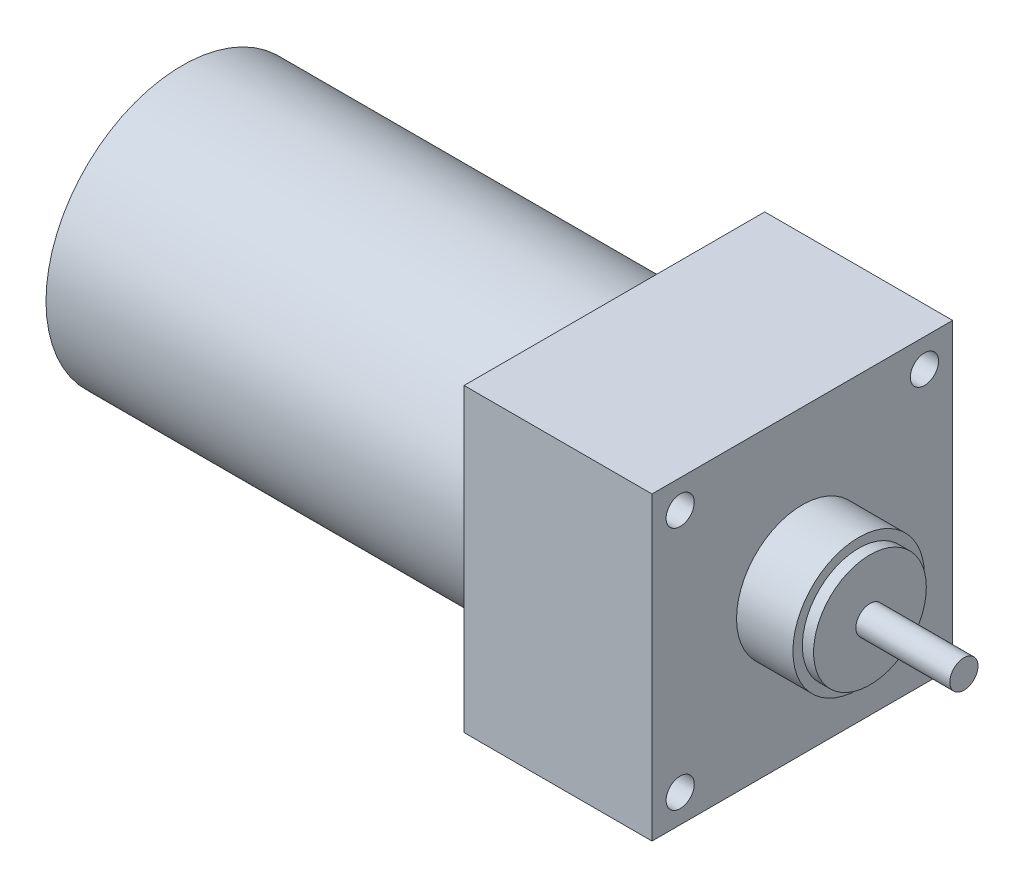
ISO-10303-21;
HEADER;
FILE_DESCRIPTION(('STEP AP214'),'2;1');
FILE_NAME('part.step','',(''),(''),'','','');
FILE_SCHEMA(('AUTOMOTIVE_DESIGN { 1 0 10303 214 1 1 1 1 }'));
ENDSEC;
DATA;
#1=APPLICATION_CONTEXT('core data for automotive mechanical design processes');
#2=APPLICATION_PROTOCOL_DEFINITION('international standard','automotive_design',2000,#1);
#3=PRODUCT_CONTEXT('',#1,'mechanical');
#4=PRODUCT('Part','Part','',(#3));
#5=PRODUCT_RELATED_PRODUCT_CATEGORY('part','',(#4));
#6=PRODUCT_DEFINITION_FORMATION('','',#4);
#7=PRODUCT_DEFINITION_CONTEXT('part definition',#1,'design');
#8=PRODUCT_DEFINITION('design','',#6,#7);
#9=PRODUCT_DEFINITION_SHAPE('','',#8);
#10=(LENGTH_UNIT() NAMED_UNIT(*) SI_UNIT(.MILLI.,.METRE.));
#11=(NAMED_UNIT(*) PLANE_ANGLE_UNIT() SI_UNIT($,.RADIAN.));
#12=(NAMED_UNIT(*) SI_UNIT($,.STERADIAN.) SOLID_ANGLE_UNIT());
#13=UNCERTAINTY_MEASURE_WITH_UNIT(LENGTH_MEASURE(1.E-05),#10,'distance_accuracy_value','');
#14=(GEOMETRIC_REPRESENTATION_CONTEXT(3) GLOBAL_UNCERTAINTY_ASSIGNED_CONTEXT((#13)) GLOBAL_UNIT_ASSIGNED_CONTEXT((#10,
#11,#12)) REPRESENTATION_CONTEXT('',''));
#15=CARTESIAN_POINT('',(0.,0.,0.));
#16=DIRECTION('',(0.,0.,1.));
#17=DIRECTION('',(1.,0.,0.));
#18=AXIS2_PLACEMENT_3D('',#15,#16,#17);
#19=CARTESIAN_POINT('',(27.2,0.,0.));
#20=DIRECTION('',(1.,0.,0.));
#21=DIRECTION('',(0.,0.,-1.));
#22=AXIS2_PLACEMENT_3D('',#19,#20,#21);
#23=PLANE('',#22);
#24=CARTESIAN_POINT('',(27.2,0.,0.));
#25=DIRECTION('',(1.,0.,0.));
#26=DIRECTION('',(0.,0.,-1.));
#27=AXIS2_PLACEMENT_3D('',#24,#25,#26);
#28=CIRCLE('',#27,6.);
#29=CARTESIAN_POINT('',(27.2,0.,-6.));
#30=VERTEX_POINT('',#29);
#31=EDGE_CURVE('E129',#30,#30,#28,.T.);
#32=ORIENTED_EDGE('',*,*,#31,.T.);
#33=EDGE_LOOP('',(#32));
#34=FACE_BOUND('',#33,.T.);
#35=CARTESIAN_POINT('',(27.2,0.,0.));
#36=DIRECTION('',(1.,0.,0.));
#37=DIRECTION('',(0.,0.,-1.));
#38=AXIS2_PLACEMENT_3D('',#35,#36,#37);
#39=CIRCLE('',#38,1.5);
#40=CARTESIAN_POINT('',(27.2,0.,-1.5));
#41=VERTEX_POINT('',#40);
#42=EDGE_CURVE('E138',#41,#41,#39,.T.);
#43=ORIENTED_EDGE('',*,*,#42,.F.);
#44=EDGE_LOOP('',(#43));
#45=FACE_BOUND('',#44,.T.);
#46=ADVANCED_FACE('F36',(#34,#45),#23,.T.);
#47=CARTESIAN_POINT('',(26.,0.,0.));
#48=DIRECTION('',(1.,0.,0.));
#49=DIRECTION('',(0.,0.,-1.));
#50=AXIS2_PLACEMENT_3D('',#47,#48,#49);
#51=PLANE('',#50);
#52=CARTESIAN_POINT('',(26.,0.,0.));
#53=DIRECTION('',(1.,0.,0.));
#54=DIRECTION('',(0.,0.,-1.));
#55=AXIS2_PLACEMENT_3D('',#52,#53,#54);
#56=CIRCLE('',#55,7.00000000000001);
#57=CARTESIAN_POINT('',(26.,0.,-7.00000000000001));
#58=VERTEX_POINT('',#57);
#59=EDGE_CURVE('E124',#58,#58,#56,.T.);
#60=ORIENTED_EDGE('',*,*,#59,.T.);
#61=EDGE_LOOP('',(#60));
#62=FACE_BOUND('',#61,.T.);
#63=CARTESIAN_POINT('',(26.,0.,0.));
#64=DIRECTION('',(1.,0.,0.));
#65=DIRECTION('',(0.,0.,-1.));
#66=AXIS2_PLACEMENT_3D('',#63,#64,#65);
#67=CIRCLE('',#66,6.);
#68=CARTESIAN_POINT('',(26.,0.,-6.));
#69=VERTEX_POINT('',#68);
#70=EDGE_CURVE('E132',#69,#69,#67,.T.);
#71=ORIENTED_EDGE('',*,*,#70,.F.);
#72=EDGE_LOOP('',(#71));
#73=FACE_BOUND('',#72,.T.);
#74=ADVANCED_FACE('F178',(#62,#73),#51,.T.);
#75=CARTESIAN_POINT('',(20.,0.,0.));
#76=DIRECTION('',(-1.,0.,0.));
#77=DIRECTION('',(0.,0.,1.));
#78=AXIS2_PLACEMENT_3D('',#75,#76,#77);
#79=PLANE('',#78);
#80=CARTESIAN_POINT('',(20.,13.,13.));
#81=DIRECTION('',(1.,0.,0.));
#82=DIRECTION('',(0.,0.,-1.));
#83=AXIS2_PLACEMENT_3D('',#80,#81,#82);
#84=CIRCLE('',#83,1.5);
#85=CARTESIAN_POINT('',(20.,13.,11.5));
#86=VERTEX_POINT('',#85);
#87=EDGE_CURVE('E162',#86,#86,#84,.T.);
#88=ORIENTED_EDGE('',*,*,#87,.F.);
#89=EDGE_LOOP('',(#88));
#90=FACE_BOUND('',#89,.T.);
#91=CARTESIAN_POINT('',(20.,13.,-13.));
#92=DIRECTION('',(1.,0.,0.));
#93=DIRECTION('',(0.,0.,-1.));
#94=AXIS2_PLACEMENT_3D('',#91,#92,#93);
#95=CIRCLE('',#94,1.5);
#96=CARTESIAN_POINT('',(20.,13.,-14.5));
#97=VERTEX_POINT('',#96);
#98=EDGE_CURVE('E156',#97,#97,#95,.T.);
#99=ORIENTED_EDGE('',*,*,#98,.F.);
#100=EDGE_LOOP('',(#99));
#101=FACE_BOUND('',#100,.T.);
#102=CARTESIAN_POINT('',(20.,-13.,-13.));
#103=DIRECTION('',(1.,0.,0.));
#104=DIRECTION('',(0.,0.,-1.));
#105=AXIS2_PLACEMENT_3D('',#102,#103,#104);
#106=CIRCLE('',#105,1.5);
#107=CARTESIAN_POINT('',(20.,-13.,-14.5));
#108=VERTEX_POINT('',#107);
#109=EDGE_CURVE('E150',#108,#108,#106,.T.);
#110=ORIENTED_EDGE('',*,*,#109,.F.);
#111=EDGE_LOOP('',(#110));
#112=FACE_BOUND('',#111,.T.);
#113=CARTESIAN_POINT('',(20.,-13.,13.));
#114=DIRECTION('',(1.,0.,0.));
#115=DIRECTION('',(0.,0.,-1.));
#116=AXIS2_PLACEMENT_3D('',#113,#114,#115);
#117=CIRCLE('',#116,1.5);
#118=CARTESIAN_POINT('',(20.,-13.,11.5));
#119=VERTEX_POINT('',#118);
#120=EDGE_CURVE('E144',#119,#119,#117,.T.);
#121=ORIENTED_EDGE('',*,*,#120,.F.);
#122=EDGE_LOOP('',(#121));
#123=FACE_BOUND('',#122,.T.);
#124=DIRECTION('',(0.,-1.,0.));
#125=VECTOR('',#124,1.);
#126=CARTESIAN_POINT('',(20.,16.,16.));
#127=LINE('',#126,#125);
#128=CARTESIAN_POINT('',(20.,16.,16.));
#129=VERTEX_POINT('',#128);
#130=CARTESIAN_POINT('',(20.,-16.,16.));
#131=VERTEX_POINT('',#130);
#132=EDGE_CURVE('E90',#129,#131,#127,.T.);
#133=ORIENTED_EDGE('',*,*,#132,.T.);
#134=DIRECTION('',(0.,0.,-1.));
#135=VECTOR('',#134,1.);
#136=CARTESIAN_POINT('',(20.,-16.,-16.));
#137=LINE('',#136,#135);
#138=CARTESIAN_POINT('',(20.,-16.,-16.));
#139=VERTEX_POINT('',#138);
#140=EDGE_CURVE('E84',#131,#139,#137,.T.);
#141=ORIENTED_EDGE('',*,*,#140,.T.);
#142=DIRECTION('',(0.,1.,0.));
#143=VECTOR('',#142,1.);
#144=CARTESIAN_POINT('',(20.,16.,-16.));
#145=LINE('',#144,#143);
#146=CARTESIAN_POINT('',(20.,16.,-16.));
#147=VERTEX_POINT('',#146);
#148=EDGE_CURVE('E88',#139,#147,#145,.T.);
#149=ORIENTED_EDGE('',*,*,#148,.T.);
#150=DIRECTION('',(0.,0.,1.));
#151=VECTOR('',#150,1.);
#152=CARTESIAN_POINT('',(20.,16.,-16.));
#153=LINE('',#152,#151);
#154=EDGE_CURVE('E53',#147,#129,#153,.T.);
#155=ORIENTED_EDGE('',*,*,#154,.T.);
#156=EDGE_LOOP('',(#133,#141,#149,#155));
#157=FACE_BOUND('',#156,.T.);
#158=CARTESIAN_POINT('',(20.,0.,0.));
#159=DIRECTION('',(-1.,0.,0.));
#160=DIRECTION('',(0.,0.,1.));
#161=AXIS2_PLACEMENT_3D('',#158,#159,#160);
#162=CIRCLE('',#161,7.00000000000001);
#163=CARTESIAN_POINT('',(20.,0.,7.00000000000001));
#164=VERTEX_POINT('',#163);
#165=EDGE_CURVE('E11',#164,#164,#162,.F.);
#166=ORIENTED_EDGE('',*,*,#165,.F.);
#167=EDGE_LOOP('',(#166));
#168=FACE_BOUND('',#167,.T.);
#169=ADVANCED_FACE('F85',(#90,#101,#112,#123,#157,#168),#79,.F.);
#170=CARTESIAN_POINT('',(0.,0.,0.));
#171=DIRECTION('',(-1.,0.,0.));
#172=DIRECTION('',(0.,0.,1.));
#173=AXIS2_PLACEMENT_3D('',#170,#171,#172);
#174=PLANE('',#173);
#175=CARTESIAN_POINT('',(0.,13.,13.));
#176=DIRECTION('',(1.,0.,0.));
#177=DIRECTION('',(0.,0.,-1.));
#178=AXIS2_PLACEMENT_3D('',#175,#176,#177);
#179=CIRCLE('',#178,1.5);
#180=CARTESIAN_POINT('',(0.,13.,11.5));
#181=VERTEX_POINT('',#180);
#182=EDGE_CURVE('E159',#181,#181,#179,.T.);
#183=ORIENTED_EDGE('',*,*,#182,.T.);
#184=EDGE_LOOP('',(#183));
#185=FACE_BOUND('',#184,.T.);
#186=CARTESIAN_POINT('',(0.,13.,-13.));
#187=DIRECTION('',(1.,0.,0.));
#188=DIRECTION('',(0.,0.,-1.));
#189=AXIS2_PLACEMENT_3D('',#186,#187,#188);
#190=CIRCLE('',#189,1.5);
#191=CARTESIAN_POINT('',(0.,13.,-14.5));
#192=VERTEX_POINT('',#191);
#193=EDGE_CURVE('E153',#192,#192,#190,.T.);
#194=ORIENTED_EDGE('',*,*,#193,.T.);
#195=EDGE_LOOP('',(#194));
#196=FACE_BOUND('',#195,.T.);
#197=CARTESIAN_POINT('',(0.,-13.,-13.));
#198=DIRECTION('',(1.,0.,0.));
#199=DIRECTION('',(0.,0.,-1.));
#200=AXIS2_PLACEMENT_3D('',#197,#198,#199);
#201=CIRCLE('',#200,1.5);
#202=CARTESIAN_POINT('',(0.,-13.,-14.5));
#203=VERTEX_POINT('',#202);
#204=EDGE_CURVE('E147',#203,#203,#201,.T.);
#205=ORIENTED_EDGE('',*,*,#204,.T.);
#206=EDGE_LOOP('',(#205));
#207=FACE_BOUND('',#206,.T.);
#208=CARTESIAN_POINT('',(0.,-13.,13.));
#209=DIRECTION('',(1.,0.,0.));
#210=DIRECTION('',(0.,0.,-1.));
#211=AXIS2_PLACEMENT_3D('',#208,#209,#210);
#212=CIRCLE('',#211,1.5);
#213=CARTESIAN_POINT('',(0.,-13.,11.5));
#214=VERTEX_POINT('',#213);
#215=EDGE_CURVE('E141',#214,#214,#212,.T.);
#216=ORIENTED_EDGE('',*,*,#215,.T.);
#217=EDGE_LOOP('',(#216));
#218=FACE_BOUND('',#217,.T.);
#219=DIRECTION('',(0.,-1.,0.));
#220=VECTOR('',#219,1.);
#221=CARTESIAN_POINT('',(0.,16.,16.));
#222=LINE('',#221,#220);
#223=CARTESIAN_POINT('',(0.,16.,16.));
#224=VERTEX_POINT('',#223);
#225=CARTESIAN_POINT('',(0.,-16.,16.));
#226=VERTEX_POINT('',#225);
#227=EDGE_CURVE('E104',#224,#226,#222,.T.);
#228=ORIENTED_EDGE('',*,*,#227,.F.);
#229=DIRECTION('',(0.,0.,1.));
#230=VECTOR('',#229,1.);
#231=CARTESIAN_POINT('',(0.,16.,-16.));
#232=LINE('',#231,#230);
#233=CARTESIAN_POINT('',(0.,16.,-16.));
#234=VERTEX_POINT('',#233);
#235=EDGE_CURVE('E76',#234,#224,#232,.T.);
#236=ORIENTED_EDGE('',*,*,#235,.F.);
#237=DIRECTION('',(0.,1.,0.));
#238=VECTOR('',#237,1.);
#239=CARTESIAN_POINT('',(0.,16.,-16.));
#240=LINE('',#239,#238);
#241=CARTESIAN_POINT('',(0.,-16.,-16.));
#242=VERTEX_POINT('',#241);
#243=EDGE_CURVE('E70',#242,#234,#240,.T.);
#244=ORIENTED_EDGE('',*,*,#243,.F.);
#245=DIRECTION('',(0.,0.,-1.));
#246=VECTOR('',#245,1.);
#247=CARTESIAN_POINT('',(0.,-16.,-16.));
#248=LINE('',#247,#246);
#249=EDGE_CURVE('E95',#226,#242,#248,.T.);
#250=ORIENTED_EDGE('',*,*,#249,.F.);
#251=EDGE_LOOP('',(#228,#236,#244,#250));
#252=FACE_BOUND('',#251,.T.);
#253=CARTESIAN_POINT('',(0.,0.,0.));
#254=DIRECTION('',(-1.,0.,0.));
#255=DIRECTION('',(0.,0.,1.));
#256=AXIS2_PLACEMENT_3D('',#253,#254,#255);
#257=CIRCLE('',#256,14.5);
#258=CARTESIAN_POINT('',(0.,0.,14.5));
#259=VERTEX_POINT('',#258);
#260=EDGE_CURVE('E122',#259,#259,#257,.T.);
#261=ORIENTED_EDGE('',*,*,#260,.F.);
#262=EDGE_LOOP('',(#261));
#263=FACE_BOUND('',#262,.T.);
#264=ADVANCED_FACE('F115',(#185,#196,#207,#218,#252,#263),#174,.T.);
#265=CARTESIAN_POINT('',(20.,16.,16.));
#266=DIRECTION('',(0.,0.,-1.));
#267=DIRECTION('',(0.,1.,0.));
#268=AXIS2_PLACEMENT_3D('',#265,#266,#267);
#269=PLANE('',#268);
#270=ORIENTED_EDGE('',*,*,#227,.T.);
#271=DIRECTION('',(-1.,0.,0.));
#272=VECTOR('',#271,1.);
#273=CARTESIAN_POINT('',(20.,-16.,16.));
#274=LINE('',#273,#272);
#275=EDGE_CURVE('E45',#131,#226,#274,.T.);
#276=ORIENTED_EDGE('',*,*,#275,.F.);
#277=ORIENTED_EDGE('',*,*,#132,.F.);
#278=DIRECTION('',(-1.,0.,0.));
#279=VECTOR('',#278,1.);
#280=CARTESIAN_POINT('',(20.,16.,16.));
#281=LINE('',#280,#279);
#282=EDGE_CURVE('E100',#129,#224,#281,.T.);
#283=ORIENTED_EDGE('',*,*,#282,.T.);
#284=EDGE_LOOP('',(#270,#276,#277,#283));
#285=FACE_BOUND('',#284,.T.);
#286=ADVANCED_FACE('F38',(#285),#269,.F.);
#287=CARTESIAN_POINT('',(20.,-16.,-16.));
#288=DIRECTION('',(0.,1.,0.));
#289=DIRECTION('',(0.,0.,1.));
#290=AXIS2_PLACEMENT_3D('',#287,#288,#289);
#291=PLANE('',#290);
#292=ORIENTED_EDGE('',*,*,#249,.T.);
#293=DIRECTION('',(-1.,0.,0.));
#294=VECTOR('',#293,1.);
#295=CARTESIAN_POINT('',(20.,-16.,-16.));
#296=LINE('',#295,#294);
#297=EDGE_CURVE('E93',#139,#242,#296,.T.);
#298=ORIENTED_EDGE('',*,*,#297,.F.);
#299=ORIENTED_EDGE('',*,*,#140,.F.);
#300=ORIENTED_EDGE('',*,*,#275,.T.);
#301=EDGE_LOOP('',(#292,#298,#299,#300));
#302=FACE_BOUND('',#301,.T.);
#303=ADVANCED_FACE('F94',(#302),#291,.F.);
#304=CARTESIAN_POINT('',(20.,16.,-16.));
#305=DIRECTION('',(0.,0.,1.));
#306=DIRECTION('',(0.,-1.,0.));
#307=AXIS2_PLACEMENT_3D('',#304,#305,#306);
#308=PLANE('',#307);
#309=ORIENTED_EDGE('',*,*,#243,.T.);
#310=DIRECTION('',(-1.,0.,0.));
#311=VECTOR('',#310,1.);
#312=CARTESIAN_POINT('',(20.,16.,-16.));
#313=LINE('',#312,#311);
#314=EDGE_CURVE('E96',#147,#234,#313,.T.);
#315=ORIENTED_EDGE('',*,*,#314,.F.);
#316=ORIENTED_EDGE('',*,*,#148,.F.);
#317=ORIENTED_EDGE('',*,*,#297,.T.);
#318=EDGE_LOOP('',(#309,#315,#316,#317));
#319=FACE_BOUND('',#318,.T.);
#320=ADVANCED_FACE('F98',(#319),#308,.F.);
#321=CARTESIAN_POINT('',(20.,16.,-16.));
#322=DIRECTION('',(0.,-1.,0.));
#323=DIRECTION('',(0.,0.,-1.));
#324=AXIS2_PLACEMENT_3D('',#321,#322,#323);
#325=PLANE('',#324);
#326=ORIENTED_EDGE('',*,*,#235,.T.);
#327=ORIENTED_EDGE('',*,*,#282,.F.);
#328=ORIENTED_EDGE('',*,*,#154,.F.);
#329=ORIENTED_EDGE('',*,*,#314,.T.);
#330=EDGE_LOOP('',(#326,#327,#328,#329));
#331=FACE_BOUND('',#330,.T.);
#332=ADVANCED_FACE('F227',(#331),#325,.F.);
#333=CARTESIAN_POINT('',(-46.,0.,0.));
#334=DIRECTION('',(1.,0.,0.));
#335=DIRECTION('',(0.,0.,-1.));
#336=AXIS2_PLACEMENT_3D('',#333,#334,#335);
#337=CYLINDRICAL_SURFACE('',#336,14.5);
#338=CARTESIAN_POINT('',(-46.,0.,0.));
#339=DIRECTION('',(-1.,0.,0.));
#340=DIRECTION('',(0.,0.,1.));
#341=AXIS2_PLACEMENT_3D('',#338,#339,#340);
#342=CIRCLE('',#341,14.5);
#343=CARTESIAN_POINT('',(-46.,0.,14.5));
#344=VERTEX_POINT('',#343);
#345=EDGE_CURVE('E107',#344,#344,#342,.T.);
#346=ORIENTED_EDGE('',*,*,#345,.F.);
#347=EDGE_LOOP('',(#346));
#348=FACE_BOUND('',#347,.T.);
#349=ORIENTED_EDGE('',*,*,#260,.T.);
#350=EDGE_LOOP('',(#349));
#351=FACE_BOUND('',#350,.T.);
#352=ADVANCED_FACE('F224',(#348,#351),#337,.T.);
#353=CARTESIAN_POINT('',(-46.,0.,0.));
#354=DIRECTION('',(-1.,0.,0.));
#355=DIRECTION('',(0.,0.,1.));
#356=AXIS2_PLACEMENT_3D('',#353,#354,#355);
#357=PLANE('',#356);
#358=ORIENTED_EDGE('',*,*,#345,.T.);
#359=EDGE_LOOP('',(#358));
#360=FACE_BOUND('',#359,.T.);
#361=ADVANCED_FACE('F220',(#360),#357,.T.);
#362=CARTESIAN_POINT('',(26.,0.,0.));
#363=DIRECTION('',(-1.,0.,0.));
#364=DIRECTION('',(0.,0.,1.));
#365=AXIS2_PLACEMENT_3D('',#362,#363,#364);
#366=CYLINDRICAL_SURFACE('',#365,7.00000000000001);
#367=ORIENTED_EDGE('',*,*,#59,.F.);
#368=EDGE_LOOP('',(#367));
#369=FACE_BOUND('',#368,.T.);
#370=ORIENTED_EDGE('',*,*,#165,.T.);
#371=EDGE_LOOP('',(#370));
#372=FACE_BOUND('',#371,.T.);
#373=ADVANCED_FACE('F215',(#369,#372),#366,.T.);
#374=CARTESIAN_POINT('',(27.2,0.,0.));
#375=DIRECTION('',(-1.,0.,0.));
#376=DIRECTION('',(0.,0.,1.));
#377=AXIS2_PLACEMENT_3D('',#374,#375,#376);
#378=CYLINDRICAL_SURFACE('',#377,6.);
#379=ORIENTED_EDGE('',*,*,#31,.F.);
#380=EDGE_LOOP('',(#379));
#381=FACE_BOUND('',#380,.T.);
#382=ORIENTED_EDGE('',*,*,#70,.T.);
#383=EDGE_LOOP('',(#382));
#384=FACE_BOUND('',#383,.T.);
#385=ADVANCED_FACE('F213',(#381,#384),#378,.T.);
#386=CARTESIAN_POINT('',(37.2,0.,0.));
#387=DIRECTION('',(-1.,0.,0.));
#388=DIRECTION('',(0.,0.,1.));
#389=AXIS2_PLACEMENT_3D('',#386,#387,#388);
#390=CYLINDRICAL_SURFACE('',#389,1.5);
#391=CARTESIAN_POINT('',(37.2,0.,0.));
#392=DIRECTION('',(1.,0.,0.));
#393=DIRECTION('',(0.,0.,-1.));
#394=AXIS2_PLACEMENT_3D('',#391,#392,#393);
#395=CIRCLE('',#394,1.5);
#396=CARTESIAN_POINT('',(37.2,0.,-1.5));
#397=VERTEX_POINT('',#396);
#398=EDGE_CURVE('E135',#397,#397,#395,.T.);
#399=ORIENTED_EDGE('',*,*,#398,.F.);
#400=EDGE_LOOP('',(#399));
#401=FACE_BOUND('',#400,.T.);
#402=ORIENTED_EDGE('',*,*,#42,.T.);
#403=EDGE_LOOP('',(#402));
#404=FACE_BOUND('',#403,.T.);
#405=ADVANCED_FACE('F198',(#401,#404),#390,.T.);
#406=CARTESIAN_POINT('',(37.2,0.,0.));
#407=DIRECTION('',(1.,0.,0.));
#408=DIRECTION('',(0.,0.,-1.));
#409=AXIS2_PLACEMENT_3D('',#406,#407,#408);
#410=PLANE('',#409);
#411=ORIENTED_EDGE('',*,*,#398,.T.);
#412=EDGE_LOOP('',(#411));
#413=FACE_BOUND('',#412,.T.);
#414=ADVANCED_FACE('F189',(#413),#410,.T.);
#415=CARTESIAN_POINT('',(0.,-13.,13.));
#416=DIRECTION('',(1.,0.,0.));
#417=DIRECTION('',(0.,0.,-1.));
#418=AXIS2_PLACEMENT_3D('',#415,#416,#417);
#419=CYLINDRICAL_SURFACE('',#418,1.5);
#420=ORIENTED_EDGE('',*,*,#215,.F.);
#421=EDGE_LOOP('',(#420));
#422=FACE_BOUND('',#421,.T.);
#423=ORIENTED_EDGE('',*,*,#120,.T.);
#424=EDGE_LOOP('',(#423));
#425=FACE_BOUND('',#424,.T.);
#426=ADVANCED_FACE('F186',(#422,#425),#419,.F.);
#427=CARTESIAN_POINT('',(0.,-13.,-13.));
#428=DIRECTION('',(1.,0.,0.));
#429=DIRECTION('',(0.,0.,-1.));
#430=AXIS2_PLACEMENT_3D('',#427,#428,#429);
#431=CYLINDRICAL_SURFACE('',#430,1.5);
#432=ORIENTED_EDGE('',*,*,#204,.F.);
#433=EDGE_LOOP('',(#432));
#434=FACE_BOUND('',#433,.T.);
#435=ORIENTED_EDGE('',*,*,#109,.T.);
#436=EDGE_LOOP('',(#435));
#437=FACE_BOUND('',#436,.T.);
#438=ADVANCED_FACE('F188',(#434,#437),#431,.F.);
#439=CARTESIAN_POINT('',(0.,13.,-13.));
#440=DIRECTION('',(1.,0.,0.));
#441=DIRECTION('',(0.,0.,-1.));
#442=AXIS2_PLACEMENT_3D('',#439,#440,#441);
#443=CYLINDRICAL_SURFACE('',#442,1.5);
#444=ORIENTED_EDGE('',*,*,#193,.F.);
#445=EDGE_LOOP('',(#444));
#446=FACE_BOUND('',#445,.T.);
#447=ORIENTED_EDGE('',*,*,#98,.T.);
#448=EDGE_LOOP('',(#447));
#449=FACE_BOUND('',#448,.T.);
#450=ADVANCED_FACE('F172',(#446,#449),#443,.F.);
#451=CARTESIAN_POINT('',(0.,13.,13.));
#452=DIRECTION('',(1.,0.,0.));
#453=DIRECTION('',(0.,0.,-1.));
#454=AXIS2_PLACEMENT_3D('',#451,#452,#453);
#455=CYLINDRICAL_SURFACE('',#454,1.5);
#456=ORIENTED_EDGE('',*,*,#182,.F.);
#457=EDGE_LOOP('',(#456));
#458=FACE_BOUND('',#457,.T.);
#459=ORIENTED_EDGE('',*,*,#87,.T.);
#460=EDGE_LOOP('',(#459));
#461=FACE_BOUND('',#460,.T.);
#462=ADVANCED_FACE('F169',(#458,#461),#455,.F.);
#463=CLOSED_SHELL('',(#46,#74,#169,#264,#286,#303,#320,#332,#352,#361,#373,#385,#405,#414,#426,
#438,#450,#462));
#464=MANIFOLD_SOLID_BREP('B2',#463);
#465=ADVANCED_BREP_SHAPE_REPRESENTATION('',(#18,#464),#14);
#466=SHAPE_DEFINITION_REPRESENTATION(#9,#465);
ENDSEC;
END-ISO-10303-21;
